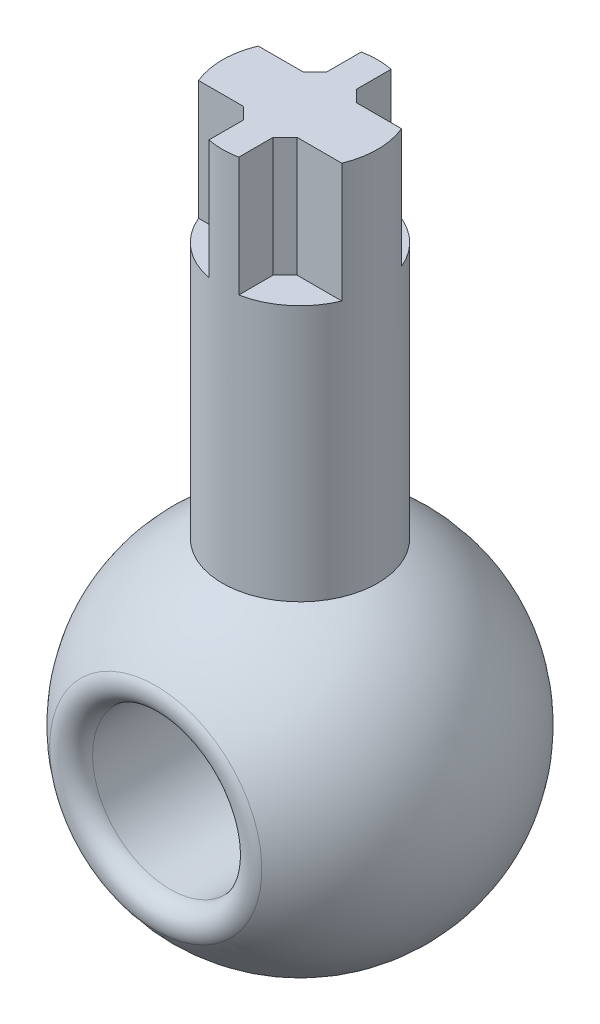
ISO-10303-21;
HEADER;
FILE_DESCRIPTION(('STEP AP214'),'2;1');
FILE_NAME('part.step','',(''),(''),'','','');
FILE_SCHEMA(('AUTOMOTIVE_DESIGN { 1 0 10303 214 1 1 1 1 }'));
ENDSEC;
DATA;
#1=APPLICATION_CONTEXT('core data for automotive mechanical design processes');
#2=APPLICATION_PROTOCOL_DEFINITION('international standard','automotive_design',2000,#1);
#3=PRODUCT_CONTEXT('',#1,'mechanical');
#4=PRODUCT('Part','Part','',(#3));
#5=PRODUCT_RELATED_PRODUCT_CATEGORY('part','',(#4));
#6=PRODUCT_DEFINITION_FORMATION('','',#4);
#7=PRODUCT_DEFINITION_CONTEXT('part definition',#1,'design');
#8=PRODUCT_DEFINITION('design','',#6,#7);
#9=PRODUCT_DEFINITION_SHAPE('','',#8);
#10=(LENGTH_UNIT() NAMED_UNIT(*) SI_UNIT(.MILLI.,.METRE.));
#11=(NAMED_UNIT(*) PLANE_ANGLE_UNIT() SI_UNIT($,.RADIAN.));
#12=(NAMED_UNIT(*) SI_UNIT($,.STERADIAN.) SOLID_ANGLE_UNIT());
#13=UNCERTAINTY_MEASURE_WITH_UNIT(LENGTH_MEASURE(1.E-05),#10,'distance_accuracy_value','');
#14=(GEOMETRIC_REPRESENTATION_CONTEXT(3) GLOBAL_UNCERTAINTY_ASSIGNED_CONTEXT((#13)) GLOBAL_UNIT_ASSIGNED_CONTEXT((#10,
#11,#12)) REPRESENTATION_CONTEXT('',''));
#15=CARTESIAN_POINT('',(0.,0.,0.));
#16=DIRECTION('',(0.,0.,1.));
#17=DIRECTION('',(1.,0.,0.));
#18=AXIS2_PLACEMENT_3D('',#15,#16,#17);
#19=CARTESIAN_POINT('',(0.,0.,0.));
#20=DIRECTION('',(-1.,0.,0.));
#21=DIRECTION('',(0.,1.,0.));
#22=AXIS2_PLACEMENT_3D('',#19,#20,#21);
#23=SPHERICAL_SURFACE('',#22,15.);
#24=CARTESIAN_POINT('',(0.,0.,12.082535094962));
#25=DIRECTION('',(0.,0.,-1.));
#26=DIRECTION('',(-1.,0.,0.));
#27=AXIS2_PLACEMENT_3D('',#24,#25,#26);
#28=CIRCLE('',#27,8.88888888888889);
#29=CARTESIAN_POINT('',(-8.88888888888889,0.,12.082535094962));
#30=VERTEX_POINT('',#29);
#31=EDGE_CURVE('E281',#30,#30,#28,.T.);
#32=ORIENTED_EDGE('',*,*,#31,.T.);
#33=EDGE_LOOP('',(#32));
#34=FACE_BOUND('',#33,.T.);
#35=CARTESIAN_POINT('',(0.,0.,-12.082535094962));
#36=DIRECTION('',(0.,0.,1.));
#37=DIRECTION('',(1.,0.,0.));
#38=AXIS2_PLACEMENT_3D('',#35,#36,#37);
#39=CIRCLE('',#38,8.88888888888889);
#40=CARTESIAN_POINT('',(8.88888888888889,0.,-12.082535094962));
#41=VERTEX_POINT('',#40);
#42=EDGE_CURVE('E278',#41,#41,#39,.T.);
#43=ORIENTED_EDGE('',*,*,#42,.T.);
#44=EDGE_LOOP('',(#43));
#45=FACE_BOUND('',#44,.T.);
#46=CARTESIAN_POINT('',(0.,13.5185058345958,0.));
#47=DIRECTION('',(0.,-1.,0.));
#48=DIRECTION('',(0.,0.,-1.));
#49=AXIS2_PLACEMENT_3D('',#46,#47,#48);
#50=CIRCLE('',#49,6.5);
#51=CARTESIAN_POINT('',(0.,13.5185058345958,-6.5));
#52=VERTEX_POINT('',#51);
#53=EDGE_CURVE('E240',#52,#52,#50,.F.);
#54=ORIENTED_EDGE('',*,*,#53,.F.);
#55=EDGE_LOOP('',(#54));
#56=FACE_BOUND('',#55,.T.);
#57=ADVANCED_FACE('F42',(#34,#45,#56),#23,.T.);
#58=CARTESIAN_POINT('',(0.,45.,0.));
#59=DIRECTION('',(0.,-1.,0.));
#60=DIRECTION('',(0.,0.,-1.));
#61=AXIS2_PLACEMENT_3D('',#58,#59,#60);
#62=CYLINDRICAL_SURFACE('',#61,6.5);
#63=CARTESIAN_POINT('',(0.,35.,0.));
#64=DIRECTION('',(0.,1.,0.));
#65=DIRECTION('',(0.,0.,1.));
#66=AXIS2_PLACEMENT_3D('',#63,#64,#65);
#67=CIRCLE('',#66,6.5);
#68=CARTESIAN_POINT('',(-6.,35.,2.5));
#69=VERTEX_POINT('',#68);
#70=CARTESIAN_POINT('',(-1.25,35.,6.37867541108654));
#71=VERTEX_POINT('',#70);
#72=EDGE_CURVE('E161',#69,#71,#67,.T.);
#73=ORIENTED_EDGE('',*,*,#72,.F.);
#74=DIRECTION('',(0.,1.,0.));
#75=VECTOR('',#74,1.);
#76=CARTESIAN_POINT('',(-6.,35.,2.5));
#77=LINE('',#76,#75);
#78=CARTESIAN_POINT('',(-6.,45.,2.5));
#79=VERTEX_POINT('',#78);
#80=EDGE_CURVE('E177',#69,#79,#77,.T.);
#81=ORIENTED_EDGE('',*,*,#80,.T.);
#82=CARTESIAN_POINT('',(0.,45.,0.));
#83=DIRECTION('',(0.,1.,0.));
#84=DIRECTION('',(0.,0.,1.));
#85=AXIS2_PLACEMENT_3D('',#82,#83,#84);
#86=CIRCLE('',#85,6.5);
#87=CARTESIAN_POINT('',(-6.,45.,-2.5));
#88=VERTEX_POINT('',#87);
#89=EDGE_CURVE('E237',#88,#79,#86,.T.);
#90=ORIENTED_EDGE('',*,*,#89,.F.);
#91=DIRECTION('',(0.,1.,0.));
#92=VECTOR('',#91,1.);
#93=CARTESIAN_POINT('',(-6.,35.,-2.5));
#94=LINE('',#93,#92);
#95=CARTESIAN_POINT('',(-6.,35.,-2.5));
#96=VERTEX_POINT('',#95);
#97=EDGE_CURVE('E228',#96,#88,#94,.T.);
#98=ORIENTED_EDGE('',*,*,#97,.F.);
#99=CARTESIAN_POINT('',(0.,35.,0.));
#100=DIRECTION('',(0.,1.,0.));
#101=DIRECTION('',(0.,0.,1.));
#102=AXIS2_PLACEMENT_3D('',#99,#100,#101);
#103=CIRCLE('',#102,6.5);
#104=CARTESIAN_POINT('',(-1.25,35.,-6.37867541108654));
#105=VERTEX_POINT('',#104);
#106=EDGE_CURVE('E219',#105,#96,#103,.T.);
#107=ORIENTED_EDGE('',*,*,#106,.F.);
#108=DIRECTION('',(0.,1.,0.));
#109=VECTOR('',#108,1.);
#110=CARTESIAN_POINT('',(-1.25,35.,-6.37867541108654));
#111=LINE('',#110,#109);
#112=CARTESIAN_POINT('',(-1.25,45.,-6.37867541108654));
#113=VERTEX_POINT('',#112);
#114=EDGE_CURVE('E232',#105,#113,#111,.T.);
#115=ORIENTED_EDGE('',*,*,#114,.T.);
#116=CARTESIAN_POINT('',(1.25,45.,-6.37867541108654));
#117=VERTEX_POINT('',#116);
#118=EDGE_CURVE('E235',#117,#113,#86,.T.);
#119=ORIENTED_EDGE('',*,*,#118,.F.);
#120=DIRECTION('',(0.,1.,0.));
#121=VECTOR('',#120,1.);
#122=CARTESIAN_POINT('',(1.25,35.,-6.37867541108654));
#123=LINE('',#122,#121);
#124=CARTESIAN_POINT('',(1.25,35.,-6.37867541108654));
#125=VERTEX_POINT('',#124);
#126=EDGE_CURVE('E193',#125,#117,#123,.T.);
#127=ORIENTED_EDGE('',*,*,#126,.F.);
#128=CARTESIAN_POINT('',(0.,35.,0.));
#129=DIRECTION('',(0.,1.,0.));
#130=DIRECTION('',(0.,0.,1.));
#131=AXIS2_PLACEMENT_3D('',#128,#129,#130);
#132=CIRCLE('',#131,6.5);
#133=CARTESIAN_POINT('',(6.,35.,-2.5));
#134=VERTEX_POINT('',#133);
#135=EDGE_CURVE('E184',#134,#125,#132,.T.);
#136=ORIENTED_EDGE('',*,*,#135,.F.);
#137=DIRECTION('',(0.,1.,0.));
#138=VECTOR('',#137,1.);
#139=CARTESIAN_POINT('',(6.,35.,-2.5));
#140=LINE('',#139,#138);
#141=CARTESIAN_POINT('',(6.,45.,-2.5));
#142=VERTEX_POINT('',#141);
#143=EDGE_CURVE('E197',#134,#142,#140,.T.);
#144=ORIENTED_EDGE('',*,*,#143,.T.);
#145=CARTESIAN_POINT('',(6.,45.,2.5));
#146=VERTEX_POINT('',#145);
#147=EDGE_CURVE('E241',#146,#142,#86,.T.);
#148=ORIENTED_EDGE('',*,*,#147,.F.);
#149=DIRECTION('',(0.,1.,0.));
#150=VECTOR('',#149,1.);
#151=CARTESIAN_POINT('',(6.,35.,2.5));
#152=LINE('',#151,#150);
#153=CARTESIAN_POINT('',(6.,35.,2.5));
#154=VERTEX_POINT('',#153);
#155=EDGE_CURVE('E211',#154,#146,#152,.T.);
#156=ORIENTED_EDGE('',*,*,#155,.F.);
#157=CARTESIAN_POINT('',(0.,35.,0.));
#158=DIRECTION('',(0.,1.,0.));
#159=DIRECTION('',(0.,0.,1.));
#160=AXIS2_PLACEMENT_3D('',#157,#158,#159);
#161=CIRCLE('',#160,6.5);
#162=CARTESIAN_POINT('',(1.25,35.,6.37867541108654));
#163=VERTEX_POINT('',#162);
#164=EDGE_CURVE('E202',#163,#154,#161,.T.);
#165=ORIENTED_EDGE('',*,*,#164,.F.);
#166=DIRECTION('',(0.,1.,0.));
#167=VECTOR('',#166,1.);
#168=CARTESIAN_POINT('',(1.25,35.,6.37867541108654));
#169=LINE('',#168,#167);
#170=CARTESIAN_POINT('',(1.25,45.,6.37867541108654));
#171=VERTEX_POINT('',#170);
#172=EDGE_CURVE('E215',#163,#171,#169,.T.);
#173=ORIENTED_EDGE('',*,*,#172,.T.);
#174=CARTESIAN_POINT('',(-1.25,45.,6.37867541108654));
#175=VERTEX_POINT('',#174);
#176=EDGE_CURVE('E176',#175,#171,#86,.T.);
#177=ORIENTED_EDGE('',*,*,#176,.F.);
#178=DIRECTION('',(0.,1.,0.));
#179=VECTOR('',#178,1.);
#180=CARTESIAN_POINT('',(-1.25,35.,6.37867541108654));
#181=LINE('',#180,#179);
#182=EDGE_CURVE('E157',#71,#175,#181,.T.);
#183=ORIENTED_EDGE('',*,*,#182,.F.);
#184=EDGE_LOOP('',(#73,#81,#90,#98,#107,#115,#119,#127,#136,#144,#148,#156,#165,#173,#177,#183));
#185=FACE_BOUND('',#184,.T.);
#186=ORIENTED_EDGE('',*,*,#53,.T.);
#187=EDGE_LOOP('',(#186));
#188=FACE_BOUND('',#187,.T.);
#189=ADVANCED_FACE('F172',(#185,#188),#62,.T.);
#190=CARTESIAN_POINT('',(0.,45.,0.));
#191=DIRECTION('',(0.,1.,0.));
#192=DIRECTION('',(0.,0.,1.));
#193=AXIS2_PLACEMENT_3D('',#190,#191,#192);
#194=PLANE('',#193);
#195=DIRECTION('',(-1.,0.,0.));
#196=VECTOR('',#195,1.);
#197=CARTESIAN_POINT('',(-1.25,45.,2.5));
#198=LINE('',#197,#196);
#199=CARTESIAN_POINT('',(-2.25000000000002,45.,2.5));
#200=VERTEX_POINT('',#199);
#201=EDGE_CURVE('E169',#200,#79,#198,.T.);
#202=ORIENTED_EDGE('',*,*,#201,.F.);
#203=DIRECTION('',(-0.707106781186551,0.,-0.707106781186544));
#204=VECTOR('',#203,1.);
#205=CARTESIAN_POINT('',(-2.25000000000002,45.,2.5));
#206=LINE('',#205,#204);
#207=CARTESIAN_POINT('',(-1.25,45.,3.50000000000001));
#208=VERTEX_POINT('',#207);
#209=EDGE_CURVE('E65',#200,#208,#206,.F.);
#210=ORIENTED_EDGE('',*,*,#209,.T.);
#211=DIRECTION('',(0.,0.,-1.));
#212=VECTOR('',#211,1.);
#213=CARTESIAN_POINT('',(-1.25,45.,2.5));
#214=LINE('',#213,#212);
#215=EDGE_CURVE('E391',#175,#208,#214,.T.);
#216=ORIENTED_EDGE('',*,*,#215,.F.);
#217=ORIENTED_EDGE('',*,*,#176,.T.);
#218=DIRECTION('',(0.,0.,1.));
#219=VECTOR('',#218,1.);
#220=CARTESIAN_POINT('',(1.25,45.,2.5));
#221=LINE('',#220,#219);
#222=CARTESIAN_POINT('',(1.25,45.,3.50000000000002));
#223=VERTEX_POINT('',#222);
#224=EDGE_CURVE('E206',#223,#171,#221,.T.);
#225=ORIENTED_EDGE('',*,*,#224,.F.);
#226=DIRECTION('',(-0.707106781186544,0.,0.707106781186551));
#227=VECTOR('',#226,1.);
#228=CARTESIAN_POINT('',(1.25,45.,3.50000000000002));
#229=LINE('',#228,#227);
#230=CARTESIAN_POINT('',(2.25000000000001,45.,2.5));
#231=VERTEX_POINT('',#230);
#232=EDGE_CURVE('E275',#223,#231,#229,.F.);
#233=ORIENTED_EDGE('',*,*,#232,.T.);
#234=DIRECTION('',(-1.,0.,0.));
#235=VECTOR('',#234,1.);
#236=CARTESIAN_POINT('',(6.,45.,2.5));
#237=LINE('',#236,#235);
#238=EDGE_CURVE('E200',#146,#231,#237,.T.);
#239=ORIENTED_EDGE('',*,*,#238,.F.);
#240=ORIENTED_EDGE('',*,*,#147,.T.);
#241=DIRECTION('',(1.,0.,0.));
#242=VECTOR('',#241,1.);
#243=CARTESIAN_POINT('',(6.,45.,-2.5));
#244=LINE('',#243,#242);
#245=CARTESIAN_POINT('',(2.25000000000002,45.,-2.5));
#246=VERTEX_POINT('',#245);
#247=EDGE_CURVE('E188',#246,#142,#244,.T.);
#248=ORIENTED_EDGE('',*,*,#247,.F.);
#249=DIRECTION('',(0.707106781186551,0.,0.707106781186544));
#250=VECTOR('',#249,1.);
#251=CARTESIAN_POINT('',(2.25000000000002,45.,-2.5));
#252=LINE('',#251,#250);
#253=CARTESIAN_POINT('',(1.25,45.,-3.50000000000001));
#254=VERTEX_POINT('',#253);
#255=EDGE_CURVE('E273',#246,#254,#252,.F.);
#256=ORIENTED_EDGE('',*,*,#255,.T.);
#257=DIRECTION('',(0.,0.,1.));
#258=VECTOR('',#257,1.);
#259=CARTESIAN_POINT('',(1.25,45.,-6.37867541108654));
#260=LINE('',#259,#258);
#261=EDGE_CURVE('E179',#117,#254,#260,.T.);
#262=ORIENTED_EDGE('',*,*,#261,.F.);
#263=ORIENTED_EDGE('',*,*,#118,.T.);
#264=DIRECTION('',(0.,0.,-1.));
#265=VECTOR('',#264,1.);
#266=CARTESIAN_POINT('',(-1.25,45.,-6.37867541108654));
#267=LINE('',#266,#265);
#268=CARTESIAN_POINT('',(-1.25,45.,-3.50000000000002));
#269=VERTEX_POINT('',#268);
#270=EDGE_CURVE('E223',#269,#113,#267,.T.);
#271=ORIENTED_EDGE('',*,*,#270,.F.);
#272=DIRECTION('',(0.707106781186544,0.,-0.707106781186551));
#273=VECTOR('',#272,1.);
#274=CARTESIAN_POINT('',(-1.25,45.,-3.50000000000002));
#275=LINE('',#274,#273);
#276=CARTESIAN_POINT('',(-2.25000000000001,45.,-2.5));
#277=VERTEX_POINT('',#276);
#278=EDGE_CURVE('E271',#269,#277,#275,.F.);
#279=ORIENTED_EDGE('',*,*,#278,.T.);
#280=DIRECTION('',(1.,0.,0.));
#281=VECTOR('',#280,1.);
#282=CARTESIAN_POINT('',(-1.25,45.,-2.5));
#283=LINE('',#282,#281);
#284=EDGE_CURVE('E217',#88,#277,#283,.T.);
#285=ORIENTED_EDGE('',*,*,#284,.F.);
#286=ORIENTED_EDGE('',*,*,#89,.T.);
#287=EDGE_LOOP('',(#202,#210,#216,#217,#225,#233,#239,#240,#248,#256,#262,#263,#271,#279,#285,#286));
#288=FACE_BOUND('',#287,.T.);
#289=ADVANCED_FACE('F299',(#288),#194,.T.);
#290=CARTESIAN_POINT('',(-1.25,35.,-6.37867541108654));
#291=DIRECTION('',(1.,0.,0.));
#292=DIRECTION('',(0.,0.,-1.));
#293=AXIS2_PLACEMENT_3D('',#290,#291,#292);
#294=PLANE('',#293);
#295=DIRECTION('',(0.,0.,-1.));
#296=VECTOR('',#295,1.);
#297=CARTESIAN_POINT('',(-1.25,35.,-6.37867541108654));
#298=LINE('',#297,#296);
#299=CARTESIAN_POINT('',(-1.25,35.,-3.50000000000002));
#300=VERTEX_POINT('',#299);
#301=EDGE_CURVE('E226',#300,#105,#298,.T.);
#302=ORIENTED_EDGE('',*,*,#301,.F.);
#303=DIRECTION('',(0.,1.,0.));
#304=VECTOR('',#303,1.);
#305=CARTESIAN_POINT('',(-1.25,45.,-3.50000000000002));
#306=LINE('',#305,#304);
#307=EDGE_CURVE('E244',#300,#269,#306,.T.);
#308=ORIENTED_EDGE('',*,*,#307,.T.);
#309=ORIENTED_EDGE('',*,*,#270,.T.);
#310=ORIENTED_EDGE('',*,*,#114,.F.);
#311=EDGE_LOOP('',(#302,#308,#309,#310));
#312=FACE_BOUND('',#311,.T.);
#313=ADVANCED_FACE('F304',(#312),#294,.F.);
#314=CARTESIAN_POINT('',(-1.25,35.,-2.5));
#315=DIRECTION('',(0.,0.,1.));
#316=DIRECTION('',(1.,0.,0.));
#317=AXIS2_PLACEMENT_3D('',#314,#315,#316);
#318=PLANE('',#317);
#319=ORIENTED_EDGE('',*,*,#284,.T.);
#320=DIRECTION('',(0.,-1.,0.));
#321=VECTOR('',#320,1.);
#322=CARTESIAN_POINT('',(-2.25000000000001,35.,-2.5));
#323=LINE('',#322,#321);
#324=CARTESIAN_POINT('',(-2.25000000000001,35.,-2.5));
#325=VERTEX_POINT('',#324);
#326=EDGE_CURVE('E247',#277,#325,#323,.T.);
#327=ORIENTED_EDGE('',*,*,#326,.T.);
#328=DIRECTION('',(1.,0.,0.));
#329=VECTOR('',#328,1.);
#330=CARTESIAN_POINT('',(-1.25,35.,-2.5));
#331=LINE('',#330,#329);
#332=EDGE_CURVE('E222',#96,#325,#331,.T.);
#333=ORIENTED_EDGE('',*,*,#332,.F.);
#334=ORIENTED_EDGE('',*,*,#97,.T.);
#335=EDGE_LOOP('',(#319,#327,#333,#334));
#336=FACE_BOUND('',#335,.T.);
#337=ADVANCED_FACE('F371',(#336),#318,.F.);
#338=CARTESIAN_POINT('',(0.,35.,0.));
#339=DIRECTION('',(0.,1.,0.));
#340=DIRECTION('',(0.,0.,1.));
#341=AXIS2_PLACEMENT_3D('',#338,#339,#340);
#342=PLANE('',#341);
#343=ORIENTED_EDGE('',*,*,#332,.T.);
#344=DIRECTION('',(-0.707106781186544,0.,0.707106781186551));
#345=VECTOR('',#344,1.);
#346=CARTESIAN_POINT('',(-2.37500000000002,35.,-2.37499999999999));
#347=LINE('',#346,#345);
#348=EDGE_CURVE('E249',#325,#300,#347,.F.);
#349=ORIENTED_EDGE('',*,*,#348,.T.);
#350=ORIENTED_EDGE('',*,*,#301,.T.);
#351=ORIENTED_EDGE('',*,*,#106,.T.);
#352=EDGE_LOOP('',(#343,#349,#350,#351));
#353=FACE_BOUND('',#352,.T.);
#354=ADVANCED_FACE('F364',(#353),#342,.T.);
#355=CARTESIAN_POINT('',(1.25,35.,2.5));
#356=DIRECTION('',(-1.,0.,0.));
#357=DIRECTION('',(0.,0.,1.));
#358=AXIS2_PLACEMENT_3D('',#355,#356,#357);
#359=PLANE('',#358);
#360=DIRECTION('',(0.,0.,1.));
#361=VECTOR('',#360,1.);
#362=CARTESIAN_POINT('',(1.25,35.,2.5));
#363=LINE('',#362,#361);
#364=CARTESIAN_POINT('',(1.25,35.,3.50000000000002));
#365=VERTEX_POINT('',#364);
#366=EDGE_CURVE('E209',#365,#163,#363,.T.);
#367=ORIENTED_EDGE('',*,*,#366,.F.);
#368=DIRECTION('',(0.,1.,0.));
#369=VECTOR('',#368,1.);
#370=CARTESIAN_POINT('',(1.25,45.,3.50000000000002));
#371=LINE('',#370,#369);
#372=EDGE_CURVE('E258',#365,#223,#371,.T.);
#373=ORIENTED_EDGE('',*,*,#372,.T.);
#374=ORIENTED_EDGE('',*,*,#224,.T.);
#375=ORIENTED_EDGE('',*,*,#172,.F.);
#376=EDGE_LOOP('',(#367,#373,#374,#375));
#377=FACE_BOUND('',#376,.T.);
#378=ADVANCED_FACE('F361',(#377),#359,.F.);
#379=CARTESIAN_POINT('',(6.,35.,2.5));
#380=DIRECTION('',(0.,0.,-1.));
#381=DIRECTION('',(-1.,0.,0.));
#382=AXIS2_PLACEMENT_3D('',#379,#380,#381);
#383=PLANE('',#382);
#384=ORIENTED_EDGE('',*,*,#238,.T.);
#385=DIRECTION('',(0.,-1.,0.));
#386=VECTOR('',#385,1.);
#387=CARTESIAN_POINT('',(2.25000000000001,35.,2.5));
#388=LINE('',#387,#386);
#389=CARTESIAN_POINT('',(2.25000000000001,35.,2.5));
#390=VERTEX_POINT('',#389);
#391=EDGE_CURVE('E261',#231,#390,#388,.T.);
#392=ORIENTED_EDGE('',*,*,#391,.T.);
#393=DIRECTION('',(-1.,0.,0.));
#394=VECTOR('',#393,1.);
#395=CARTESIAN_POINT('',(6.,35.,2.5));
#396=LINE('',#395,#394);
#397=EDGE_CURVE('E205',#154,#390,#396,.T.);
#398=ORIENTED_EDGE('',*,*,#397,.F.);
#399=ORIENTED_EDGE('',*,*,#155,.T.);
#400=EDGE_LOOP('',(#384,#392,#398,#399));
#401=FACE_BOUND('',#400,.T.);
#402=ADVANCED_FACE('F359',(#401),#383,.F.);
#403=CARTESIAN_POINT('',(0.,35.,0.));
#404=DIRECTION('',(0.,1.,0.));
#405=DIRECTION('',(0.,0.,1.));
#406=AXIS2_PLACEMENT_3D('',#403,#404,#405);
#407=PLANE('',#406);
#408=ORIENTED_EDGE('',*,*,#397,.T.);
#409=DIRECTION('',(0.707106781186544,0.,-0.707106781186551));
#410=VECTOR('',#409,1.);
#411=CARTESIAN_POINT('',(2.37500000000002,35.,2.37499999999999));
#412=LINE('',#411,#410);
#413=EDGE_CURVE('E263',#390,#365,#412,.F.);
#414=ORIENTED_EDGE('',*,*,#413,.T.);
#415=ORIENTED_EDGE('',*,*,#366,.T.);
#416=ORIENTED_EDGE('',*,*,#164,.T.);
#417=EDGE_LOOP('',(#408,#414,#415,#416));
#418=FACE_BOUND('',#417,.T.);
#419=ADVANCED_FACE('F352',(#418),#407,.T.);
#420=CARTESIAN_POINT('',(6.,35.,-2.5));
#421=DIRECTION('',(0.,0.,1.));
#422=DIRECTION('',(1.,0.,0.));
#423=AXIS2_PLACEMENT_3D('',#420,#421,#422);
#424=PLANE('',#423);
#425=DIRECTION('',(1.,0.,0.));
#426=VECTOR('',#425,1.);
#427=CARTESIAN_POINT('',(6.,35.,-2.5));
#428=LINE('',#427,#426);
#429=CARTESIAN_POINT('',(2.25000000000002,35.,-2.5));
#430=VERTEX_POINT('',#429);
#431=EDGE_CURVE('E191',#430,#134,#428,.T.);
#432=ORIENTED_EDGE('',*,*,#431,.F.);
#433=DIRECTION('',(0.,1.,0.));
#434=VECTOR('',#433,1.);
#435=CARTESIAN_POINT('',(2.25000000000002,45.,-2.5));
#436=LINE('',#435,#434);
#437=EDGE_CURVE('E251',#430,#246,#436,.T.);
#438=ORIENTED_EDGE('',*,*,#437,.T.);
#439=ORIENTED_EDGE('',*,*,#247,.T.);
#440=ORIENTED_EDGE('',*,*,#143,.F.);
#441=EDGE_LOOP('',(#432,#438,#439,#440));
#442=FACE_BOUND('',#441,.T.);
#443=ADVANCED_FACE('F349',(#442),#424,.F.);
#444=CARTESIAN_POINT('',(1.25,35.,-6.37867541108654));
#445=DIRECTION('',(-1.,0.,0.));
#446=DIRECTION('',(0.,0.,1.));
#447=AXIS2_PLACEMENT_3D('',#444,#445,#446);
#448=PLANE('',#447);
#449=ORIENTED_EDGE('',*,*,#261,.T.);
#450=DIRECTION('',(0.,-1.,0.));
#451=VECTOR('',#450,1.);
#452=CARTESIAN_POINT('',(1.25,35.,-3.50000000000001));
#453=LINE('',#452,#451);
#454=CARTESIAN_POINT('',(1.25,35.,-3.50000000000001));
#455=VERTEX_POINT('',#454);
#456=EDGE_CURVE('E254',#254,#455,#453,.T.);
#457=ORIENTED_EDGE('',*,*,#456,.T.);
#458=DIRECTION('',(0.,0.,1.));
#459=VECTOR('',#458,1.);
#460=CARTESIAN_POINT('',(1.25,35.,-6.37867541108654));
#461=LINE('',#460,#459);
#462=EDGE_CURVE('E187',#125,#455,#461,.T.);
#463=ORIENTED_EDGE('',*,*,#462,.F.);
#464=ORIENTED_EDGE('',*,*,#126,.T.);
#465=EDGE_LOOP('',(#449,#457,#463,#464));
#466=FACE_BOUND('',#465,.T.);
#467=ADVANCED_FACE('F347',(#466),#448,.F.);
#468=CARTESIAN_POINT('',(0.,35.,0.));
#469=DIRECTION('',(0.,1.,0.));
#470=DIRECTION('',(0.,0.,1.));
#471=AXIS2_PLACEMENT_3D('',#468,#469,#470);
#472=PLANE('',#471);
#473=ORIENTED_EDGE('',*,*,#462,.T.);
#474=DIRECTION('',(-0.707106781186551,0.,-0.707106781186544));
#475=VECTOR('',#474,1.);
#476=CARTESIAN_POINT('',(2.375,35.,-2.37500000000002));
#477=LINE('',#476,#475);
#478=EDGE_CURVE('E256',#455,#430,#477,.F.);
#479=ORIENTED_EDGE('',*,*,#478,.T.);
#480=ORIENTED_EDGE('',*,*,#431,.T.);
#481=ORIENTED_EDGE('',*,*,#135,.T.);
#482=EDGE_LOOP('',(#473,#479,#480,#481));
#483=FACE_BOUND('',#482,.T.);
#484=ADVANCED_FACE('F341',(#483),#472,.T.);
#485=CARTESIAN_POINT('',(-1.25,35.,2.5));
#486=DIRECTION('',(0.,0.,-1.));
#487=DIRECTION('',(-1.,0.,0.));
#488=AXIS2_PLACEMENT_3D('',#485,#486,#487);
#489=PLANE('',#488);
#490=DIRECTION('',(-1.,0.,0.));
#491=VECTOR('',#490,1.);
#492=CARTESIAN_POINT('',(-1.25,35.,2.5));
#493=LINE('',#492,#491);
#494=CARTESIAN_POINT('',(-2.25000000000002,35.,2.5));
#495=VERTEX_POINT('',#494);
#496=EDGE_CURVE('E160',#495,#69,#493,.T.);
#497=ORIENTED_EDGE('',*,*,#496,.F.);
#498=DIRECTION('',(0.,1.,0.));
#499=VECTOR('',#498,1.);
#500=CARTESIAN_POINT('',(-2.25000000000002,45.,2.5));
#501=LINE('',#500,#499);
#502=EDGE_CURVE('E265',#495,#200,#501,.T.);
#503=ORIENTED_EDGE('',*,*,#502,.T.);
#504=ORIENTED_EDGE('',*,*,#201,.T.);
#505=ORIENTED_EDGE('',*,*,#80,.F.);
#506=EDGE_LOOP('',(#497,#503,#504,#505));
#507=FACE_BOUND('',#506,.T.);
#508=ADVANCED_FACE('F338',(#507),#489,.F.);
#509=CARTESIAN_POINT('',(-1.25,35.,2.5));
#510=DIRECTION('',(1.,0.,0.));
#511=DIRECTION('',(0.,0.,-1.));
#512=AXIS2_PLACEMENT_3D('',#509,#510,#511);
#513=PLANE('',#512);
#514=ORIENTED_EDGE('',*,*,#215,.T.);
#515=DIRECTION('',(0.,-1.,0.));
#516=VECTOR('',#515,1.);
#517=CARTESIAN_POINT('',(-1.25,35.,3.50000000000001));
#518=LINE('',#517,#516);
#519=CARTESIAN_POINT('',(-1.25,35.,3.50000000000001));
#520=VERTEX_POINT('',#519);
#521=EDGE_CURVE('E57',#208,#520,#518,.T.);
#522=ORIENTED_EDGE('',*,*,#521,.T.);
#523=DIRECTION('',(0.,0.,-1.));
#524=VECTOR('',#523,1.);
#525=CARTESIAN_POINT('',(-1.25,35.,2.5));
#526=LINE('',#525,#524);
#527=EDGE_CURVE('E153',#71,#520,#526,.T.);
#528=ORIENTED_EDGE('',*,*,#527,.F.);
#529=ORIENTED_EDGE('',*,*,#182,.T.);
#530=EDGE_LOOP('',(#514,#522,#528,#529));
#531=FACE_BOUND('',#530,.T.);
#532=ADVANCED_FACE('F155',(#531),#513,.F.);
#533=CARTESIAN_POINT('',(0.,35.,0.));
#534=DIRECTION('',(0.,1.,0.));
#535=DIRECTION('',(0.,0.,1.));
#536=AXIS2_PLACEMENT_3D('',#533,#534,#535);
#537=PLANE('',#536);
#538=ORIENTED_EDGE('',*,*,#527,.T.);
#539=DIRECTION('',(0.707106781186551,0.,0.707106781186544));
#540=VECTOR('',#539,1.);
#541=CARTESIAN_POINT('',(-2.375,35.,2.37500000000002));
#542=LINE('',#541,#540);
#543=EDGE_CURVE('E269',#520,#495,#542,.F.);
#544=ORIENTED_EDGE('',*,*,#543,.T.);
#545=ORIENTED_EDGE('',*,*,#496,.T.);
#546=ORIENTED_EDGE('',*,*,#72,.T.);
#547=EDGE_LOOP('',(#538,#544,#545,#546));
#548=FACE_BOUND('',#547,.T.);
#549=ADVANCED_FACE('F164',(#548),#537,.T.);
#550=CARTESIAN_POINT('',(-1.25,35.,-3.50000000000002));
#551=DIRECTION('',(-0.707106781186551,0.,-0.707106781186544));
#552=DIRECTION('',(-0.707106781186544,0.,0.707106781186551));
#553=AXIS2_PLACEMENT_3D('',#550,#551,#552);
#554=PLANE('',#553);
#555=ORIENTED_EDGE('',*,*,#348,.F.);
#556=ORIENTED_EDGE('',*,*,#326,.F.);
#557=ORIENTED_EDGE('',*,*,#278,.F.);
#558=ORIENTED_EDGE('',*,*,#307,.F.);
#559=EDGE_LOOP('',(#555,#556,#557,#558));
#560=FACE_BOUND('',#559,.T.);
#561=ADVANCED_FACE('F308',(#560),#554,.T.);
#562=CARTESIAN_POINT('',(2.25000000000002,35.,-2.5));
#563=DIRECTION('',(0.707106781186544,0.,-0.707106781186551));
#564=DIRECTION('',(-0.707106781186551,0.,-0.707106781186544));
#565=AXIS2_PLACEMENT_3D('',#562,#563,#564);
#566=PLANE('',#565);
#567=ORIENTED_EDGE('',*,*,#478,.F.);
#568=ORIENTED_EDGE('',*,*,#456,.F.);
#569=ORIENTED_EDGE('',*,*,#255,.F.);
#570=ORIENTED_EDGE('',*,*,#437,.F.);
#571=EDGE_LOOP('',(#567,#568,#569,#570));
#572=FACE_BOUND('',#571,.T.);
#573=ADVANCED_FACE('F311',(#572),#566,.T.);
#574=CARTESIAN_POINT('',(1.25,35.,3.50000000000002));
#575=DIRECTION('',(0.707106781186551,0.,0.707106781186544));
#576=DIRECTION('',(0.707106781186544,0.,-0.707106781186551));
#577=AXIS2_PLACEMENT_3D('',#574,#575,#576);
#578=PLANE('',#577);
#579=ORIENTED_EDGE('',*,*,#413,.F.);
#580=ORIENTED_EDGE('',*,*,#391,.F.);
#581=ORIENTED_EDGE('',*,*,#232,.F.);
#582=ORIENTED_EDGE('',*,*,#372,.F.);
#583=EDGE_LOOP('',(#579,#580,#581,#582));
#584=FACE_BOUND('',#583,.T.);
#585=ADVANCED_FACE('F315',(#584),#578,.T.);
#586=CARTESIAN_POINT('',(-2.25000000000002,35.,2.5));
#587=DIRECTION('',(-0.707106781186544,0.,0.707106781186551));
#588=DIRECTION('',(0.707106781186551,0.,0.707106781186544));
#589=AXIS2_PLACEMENT_3D('',#586,#587,#588);
#590=PLANE('',#589);
#591=ORIENTED_EDGE('',*,*,#543,.F.);
#592=ORIENTED_EDGE('',*,*,#521,.F.);
#593=ORIENTED_EDGE('',*,*,#209,.F.);
#594=ORIENTED_EDGE('',*,*,#502,.F.);
#595=EDGE_LOOP('',(#591,#592,#593,#594));
#596=FACE_BOUND('',#595,.T.);
#597=ADVANCED_FACE('F319',(#596),#590,.T.);
#598=CARTESIAN_POINT('',(0.,0.,-15.));
#599=DIRECTION('',(0.,0.,1.));
#600=DIRECTION('',(1.,0.,0.));
#601=AXIS2_PLACEMENT_3D('',#598,#599,#600);
#602=CYLINDRICAL_SURFACE('',#601,6.5);
#603=CARTESIAN_POINT('',(0.,0.,10.8742815854658));
#604=DIRECTION('',(0.,0.,-1.));
#605=DIRECTION('',(-1.,0.,0.));
#606=AXIS2_PLACEMENT_3D('',#603,#604,#605);
#607=CIRCLE('',#606,6.5);
#608=CARTESIAN_POINT('',(-6.5,0.,10.8742815854658));
#609=VERTEX_POINT('',#608);
#610=EDGE_CURVE('E11',#609,#609,#607,.F.);
#611=ORIENTED_EDGE('',*,*,#610,.T.);
#612=EDGE_LOOP('',(#611));
#613=FACE_BOUND('',#612,.T.);
#614=CARTESIAN_POINT('',(0.,0.,-10.8742815854658));
#615=DIRECTION('',(0.,0.,1.));
#616=DIRECTION('',(1.,0.,0.));
#617=AXIS2_PLACEMENT_3D('',#614,#615,#616);
#618=CIRCLE('',#617,6.5);
#619=CARTESIAN_POINT('',(6.5,0.,-10.8742815854658));
#620=VERTEX_POINT('',#619);
#621=EDGE_CURVE('E50',#620,#620,#618,.F.);
#622=ORIENTED_EDGE('',*,*,#621,.T.);
#623=EDGE_LOOP('',(#622));
#624=FACE_BOUND('',#623,.T.);
#625=ADVANCED_FACE('F286',(#613,#624),#602,.F.);
#626=CARTESIAN_POINT('',(0.,0.,10.8742815854658));
#627=DIRECTION('',(0.,0.,-1.));
#628=DIRECTION('',(-1.,0.,0.));
#629=AXIS2_PLACEMENT_3D('',#626,#627,#628);
#630=TOROIDAL_SURFACE('',#629,8.,1.5);
#631=ORIENTED_EDGE('',*,*,#610,.F.);
#632=EDGE_LOOP('',(#631));
#633=FACE_BOUND('',#632,.T.);
#634=ORIENTED_EDGE('',*,*,#31,.F.);
#635=EDGE_LOOP('',(#634));
#636=FACE_BOUND('',#635,.T.);
#637=ADVANCED_FACE('F290',(#633,#636),#630,.T.);
#638=CARTESIAN_POINT('',(0.,0.,-10.8742815854658));
#639=DIRECTION('',(0.,0.,1.));
#640=DIRECTION('',(1.,0.,0.));
#641=AXIS2_PLACEMENT_3D('',#638,#639,#640);
#642=TOROIDAL_SURFACE('',#641,8.,1.5);
#643=ORIENTED_EDGE('',*,*,#621,.F.);
#644=EDGE_LOOP('',(#643));
#645=FACE_BOUND('',#644,.T.);
#646=ORIENTED_EDGE('',*,*,#42,.F.);
#647=EDGE_LOOP('',(#646));
#648=FACE_BOUND('',#647,.T.);
#649=ADVANCED_FACE('F44',(#645,#648),#642,.T.);
#650=CLOSED_SHELL('',(#57,#189,#289,#313,#337,#354,#378,#402,#419,#443,#467,#484,#508,#532,#549,
#561,#573,#585,#597,#625,#637,#649));
#651=MANIFOLD_SOLID_BREP('B2',#650);
#652=ADVANCED_BREP_SHAPE_REPRESENTATION('',(#18,#651),#14);
#653=SHAPE_DEFINITION_REPRESENTATION(#9,#652);
ENDSEC;
END-ISO-10303-21;
